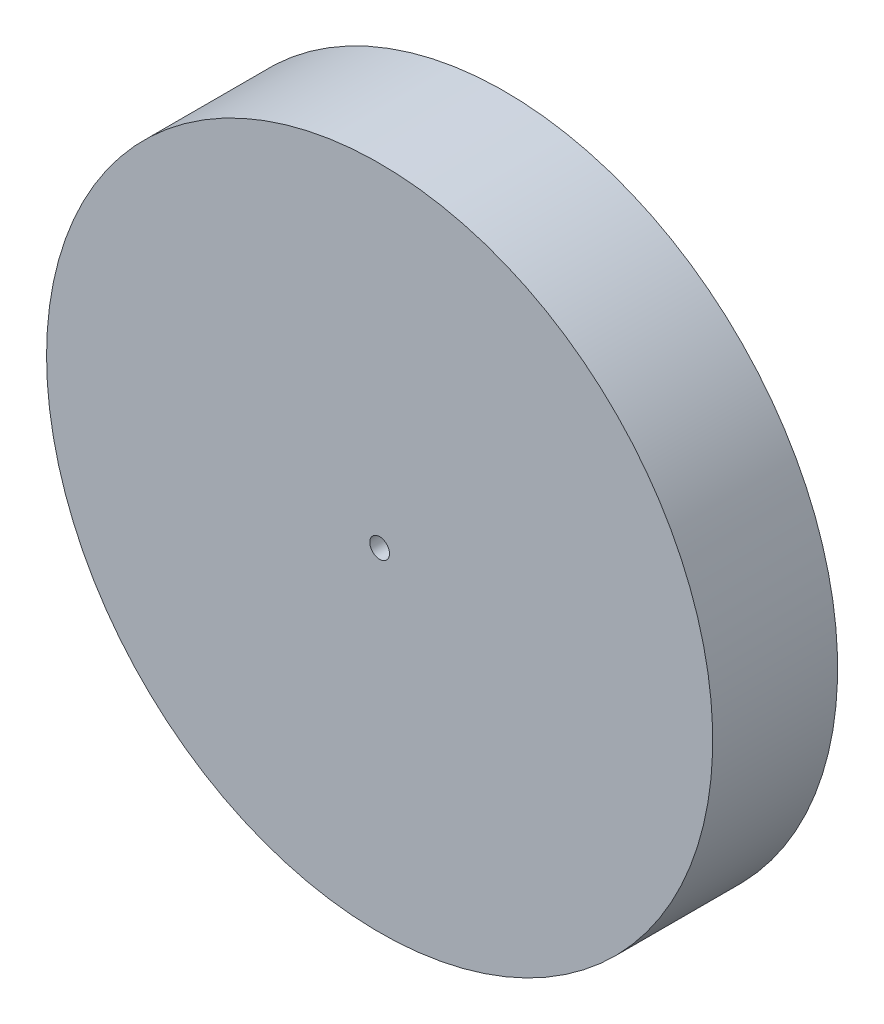
ISO-10303-21;
HEADER;
FILE_DESCRIPTION(('STEP AP214'),'2;1');
FILE_NAME('part.step','',(''),(''),'','','');
FILE_SCHEMA(('AUTOMOTIVE_DESIGN { 1 0 10303 214 1 1 1 1 }'));
ENDSEC;
DATA;
#1=APPLICATION_CONTEXT('core data for automotive mechanical design processes');
#2=APPLICATION_PROTOCOL_DEFINITION('international standard','automotive_design',2000,#1);
#3=PRODUCT_CONTEXT('',#1,'mechanical');
#4=PRODUCT('Part','Part','',(#3));
#5=PRODUCT_RELATED_PRODUCT_CATEGORY('part','',(#4));
#6=PRODUCT_DEFINITION_FORMATION('','',#4);
#7=PRODUCT_DEFINITION_CONTEXT('part definition',#1,'design');
#8=PRODUCT_DEFINITION('design','',#6,#7);
#9=PRODUCT_DEFINITION_SHAPE('','',#8);
#10=(LENGTH_UNIT() NAMED_UNIT(*) SI_UNIT(.MILLI.,.METRE.));
#11=(NAMED_UNIT(*) PLANE_ANGLE_UNIT() SI_UNIT($,.RADIAN.));
#12=(NAMED_UNIT(*) SI_UNIT($,.STERADIAN.) SOLID_ANGLE_UNIT());
#13=UNCERTAINTY_MEASURE_WITH_UNIT(LENGTH_MEASURE(1.E-05),#10,'distance_accuracy_value','');
#14=(GEOMETRIC_REPRESENTATION_CONTEXT(3) GLOBAL_UNCERTAINTY_ASSIGNED_CONTEXT((#13)) GLOBAL_UNIT_ASSIGNED_CONTEXT((#10,
#11,#12)) REPRESENTATION_CONTEXT('',''));
#15=CARTESIAN_POINT('',(0.,0.,0.));
#16=DIRECTION('',(0.,0.,1.));
#17=DIRECTION('',(1.,0.,0.));
#18=AXIS2_PLACEMENT_3D('',#15,#16,#17);
#19=CARTESIAN_POINT('',(0.,0.,19.05));
#20=DIRECTION('',(0.,0.,-1.));
#21=DIRECTION('',(-1.,0.,0.));
#22=AXIS2_PLACEMENT_3D('',#19,#20,#21);
#23=CYLINDRICAL_SURFACE('',#22,50.8);
#24=CARTESIAN_POINT('',(0.,0.,19.05));
#25=DIRECTION('',(0.,0.,1.));
#26=DIRECTION('',(1.,0.,0.));
#27=AXIS2_PLACEMENT_3D('',#24,#25,#26);
#28=CIRCLE('',#27,50.8);
#29=CARTESIAN_POINT('',(-50.8,0.,19.05));
#30=VERTEX_POINT('',#29);
#31=EDGE_CURVE('E10',#30,#30,#28,.T.);
#32=CARTESIAN_POINT('',(0.,0.,0.));
#33=DIRECTION('',(0.,0.,1.));
#34=DIRECTION('',(1.,0.,0.));
#35=AXIS2_PLACEMENT_3D('',#32,#33,#34);
#36=CIRCLE('',#35,50.8);
#37=CARTESIAN_POINT('',(-50.8,0.,0.));
#38=VERTEX_POINT('',#37);
#39=EDGE_CURVE('E33',#38,#38,#36,.T.);
#40=CARTESIAN_POINT('',(-50.8,0.,19.05));
#41=CARTESIAN_POINT('',(-50.8,0.,18.8515625));
#42=CARTESIAN_POINT('',(-50.8,0.,18.653125));
#43=CARTESIAN_POINT('',(-50.8,0.,18.25625));
#44=CARTESIAN_POINT('',(-50.8,0.,18.0578125));
#45=CARTESIAN_POINT('',(-50.8,0.,17.6609375));
#46=CARTESIAN_POINT('',(-50.8,0.,17.4625));
#47=CARTESIAN_POINT('',(-50.8,0.,17.065625));
#48=CARTESIAN_POINT('',(-50.8,0.,16.8671875));
#49=CARTESIAN_POINT('',(-50.8,0.,16.4703125));
#50=CARTESIAN_POINT('',(-50.8,0.,16.271875));
#51=CARTESIAN_POINT('',(-50.8,0.,15.875));
#52=CARTESIAN_POINT('',(-50.8,0.,15.6765625));
#53=CARTESIAN_POINT('',(-50.8,0.,15.2796875));
#54=CARTESIAN_POINT('',(-50.8,0.,15.08125));
#55=CARTESIAN_POINT('',(-50.8,0.,14.684375));
#56=CARTESIAN_POINT('',(-50.8,0.,14.4859375));
#57=CARTESIAN_POINT('',(-50.8,0.,14.0890625));
#58=CARTESIAN_POINT('',(-50.8,0.,13.890625));
#59=CARTESIAN_POINT('',(-50.8,0.,13.49375));
#60=CARTESIAN_POINT('',(-50.8,0.,13.2953125));
#61=CARTESIAN_POINT('',(-50.8,0.,12.8984375));
#62=CARTESIAN_POINT('',(-50.8,0.,12.7));
#63=CARTESIAN_POINT('',(-50.8,0.,12.303125));
#64=CARTESIAN_POINT('',(-50.8,0.,12.1046875));
#65=CARTESIAN_POINT('',(-50.8,0.,11.7078125));
#66=CARTESIAN_POINT('',(-50.8,0.,11.509375));
#67=CARTESIAN_POINT('',(-50.8,0.,11.1125));
#68=CARTESIAN_POINT('',(-50.8,0.,10.9140625));
#69=CARTESIAN_POINT('',(-50.8,0.,10.5171875));
#70=CARTESIAN_POINT('',(-50.8,0.,10.31875));
#71=CARTESIAN_POINT('',(-50.8,0.,9.921875));
#72=CARTESIAN_POINT('',(-50.8,0.,9.7234375));
#73=CARTESIAN_POINT('',(-50.8,0.,9.3265625));
#74=CARTESIAN_POINT('',(-50.8,0.,9.128125));
#75=CARTESIAN_POINT('',(-50.8,0.,8.73125));
#76=CARTESIAN_POINT('',(-50.8,0.,8.5328125));
#77=CARTESIAN_POINT('',(-50.8,0.,8.1359375));
#78=CARTESIAN_POINT('',(-50.8,0.,7.9375));
#79=CARTESIAN_POINT('',(-50.8,0.,7.540625));
#80=CARTESIAN_POINT('',(-50.8,0.,7.3421875));
#81=CARTESIAN_POINT('',(-50.8,0.,6.9453125));
#82=CARTESIAN_POINT('',(-50.8,0.,6.746875));
#83=CARTESIAN_POINT('',(-50.8,0.,6.35));
#84=CARTESIAN_POINT('',(-50.8,0.,6.1515625));
#85=CARTESIAN_POINT('',(-50.8,0.,5.7546875));
#86=CARTESIAN_POINT('',(-50.8,0.,5.55625));
#87=CARTESIAN_POINT('',(-50.8,0.,5.159375));
#88=CARTESIAN_POINT('',(-50.8,0.,4.9609375));
#89=CARTESIAN_POINT('',(-50.8,0.,4.5640625));
#90=CARTESIAN_POINT('',(-50.8,0.,4.365625));
#91=CARTESIAN_POINT('',(-50.8,0.,3.96875));
#92=CARTESIAN_POINT('',(-50.8,0.,3.7703125));
#93=CARTESIAN_POINT('',(-50.8,0.,3.3734375));
#94=CARTESIAN_POINT('',(-50.8,0.,3.175));
#95=CARTESIAN_POINT('',(-50.8,0.,2.778125));
#96=CARTESIAN_POINT('',(-50.8,0.,2.5796875));
#97=CARTESIAN_POINT('',(-50.8,0.,2.1828125));
#98=CARTESIAN_POINT('',(-50.8,0.,1.984375));
#99=CARTESIAN_POINT('',(-50.8,0.,1.5875));
#100=CARTESIAN_POINT('',(-50.8,0.,1.3890625));
#101=CARTESIAN_POINT('',(-50.8,0.,0.992187500000001));
#102=CARTESIAN_POINT('',(-50.8,0.,0.793750000000001));
#103=CARTESIAN_POINT('',(-50.8,0.,0.396875));
#104=CARTESIAN_POINT('',(-50.8,0.,0.1984375));
#105=CARTESIAN_POINT('',(-50.8,0.,0.));
#106=B_SPLINE_CURVE_WITH_KNOTS('',3,(#40,#41,#42,#43,#44,#45,#46,#47,#48,#49,#50,#51,#52,#53,
#54,#55,#56,#57,#58,#59,#60,#61,#62,#63,#64,#65,#66,#67,#68,#69,#70,#71,#72,#73,#74,#75,#76,#77,
#78,#79,#80,#81,#82,#83,#84,#85,#86,#87,#88,#89,#90,#91,#92,#93,#94,#95,#96,#97,#98,#99,#100,
#101,#102,#103,#104,#105),.UNSPECIFIED.,.F.,.F.,(4,2,2,2,2,2,2,2,2,2,2,2,2,2,2,2,2,2,2,2,2,2,2,
2,2,2,2,2,2,2,2,2,4),(0.,0.595312499999997,1.190625,1.7859375,2.38125,2.9765625,3.571875,
4.1671875,4.7625,5.3578125,5.953125,6.5484375,7.14375,7.7390625,8.334375,8.9296875,9.525,
10.1203125,10.715625,11.3109375,11.90625,12.5015625,13.096875,13.6921875,14.2875,14.8828125,
15.478125,16.0734375,16.66875,17.2640625,17.859375,18.4546875,19.05),.UNSPECIFIED.);
#107=EDGE_CURVE('BSEAM30',#30,#38,#106,.T.);
#108=ORIENTED_EDGE('',*,*,#31,.F.);
#109=ORIENTED_EDGE('',*,*,#39,.T.);
#110=ORIENTED_EDGE('',*,*,#107,.T.);
#111=ORIENTED_EDGE('',*,*,#107,.F.);
#112=EDGE_LOOP('',(#108,#110,#109,#111));
#113=FACE_BOUND('',#112,.T.);
#114=ADVANCED_FACE('F30',(#113),#23,.T.);
#115=CARTESIAN_POINT('',(0.,0.,19.05));
#116=DIRECTION('',(0.,0.,1.));
#117=DIRECTION('',(1.,0.,0.));
#118=AXIS2_PLACEMENT_3D('',#115,#116,#117);
#119=PLANE('',#118);
#120=CARTESIAN_POINT('',(0.,0.,19.05));
#121=DIRECTION('',(0.,0.,1.));
#122=DIRECTION('',(1.,0.,0.));
#123=AXIS2_PLACEMENT_3D('',#120,#121,#122);
#124=CIRCLE('',#123,1.49999999999999);
#125=CARTESIAN_POINT('',(1.49999999999999,0.,19.05));
#126=VERTEX_POINT('',#125);
#127=EDGE_CURVE('E44',#126,#126,#124,.T.);
#128=ORIENTED_EDGE('',*,*,#127,.F.);
#129=EDGE_LOOP('',(#128));
#130=FACE_BOUND('',#129,.T.);
#131=ORIENTED_EDGE('',*,*,#31,.T.);
#132=EDGE_LOOP('',(#131));
#133=FACE_BOUND('',#132,.T.);
#134=ADVANCED_FACE('F50',(#130,#133),#119,.T.);
#135=CARTESIAN_POINT('',(0.,0.,0.));
#136=DIRECTION('',(0.,0.,1.));
#137=DIRECTION('',(1.,0.,0.));
#138=AXIS2_PLACEMENT_3D('',#135,#136,#137);
#139=PLANE('',#138);
#140=CARTESIAN_POINT('',(0.,0.,0.));
#141=DIRECTION('',(0.,0.,1.));
#142=DIRECTION('',(1.,0.,0.));
#143=AXIS2_PLACEMENT_3D('',#140,#141,#142);
#144=CIRCLE('',#143,1.5);
#145=CARTESIAN_POINT('',(1.5,0.,0.));
#146=VERTEX_POINT('',#145);
#147=EDGE_CURVE('E40',#146,#146,#144,.T.);
#148=ORIENTED_EDGE('',*,*,#147,.T.);
#149=EDGE_LOOP('',(#148));
#150=FACE_BOUND('',#149,.T.);
#151=ORIENTED_EDGE('',*,*,#39,.F.);
#152=EDGE_LOOP('',(#151));
#153=FACE_BOUND('',#152,.T.);
#154=ADVANCED_FACE('F52',(#150,#153),#139,.F.);
#155=CARTESIAN_POINT('',(0.,0.,19.05));
#156=DIRECTION('',(0.,0.,1.));
#157=DIRECTION('',(1.,0.,0.));
#158=AXIS2_PLACEMENT_3D('',#155,#156,#157);
#159=CYLINDRICAL_SURFACE('',#158,1.49999999999999);
#160=ORIENTED_EDGE('',*,*,#147,.F.);
#161=EDGE_LOOP('',(#160));
#162=FACE_BOUND('',#161,.T.);
#163=ORIENTED_EDGE('',*,*,#127,.T.);
#164=EDGE_LOOP('',(#163));
#165=FACE_BOUND('',#164,.T.);
#166=ADVANCED_FACE('F48',(#162,#165),#159,.F.);
#167=CLOSED_SHELL('',(#114,#134,#154,#166));
#168=MANIFOLD_SOLID_BREP('B2',#167);
#169=ADVANCED_BREP_SHAPE_REPRESENTATION('',(#18,#168),#14);
#170=SHAPE_DEFINITION_REPRESENTATION(#9,#169);
ENDSEC;
END-ISO-10303-21;
